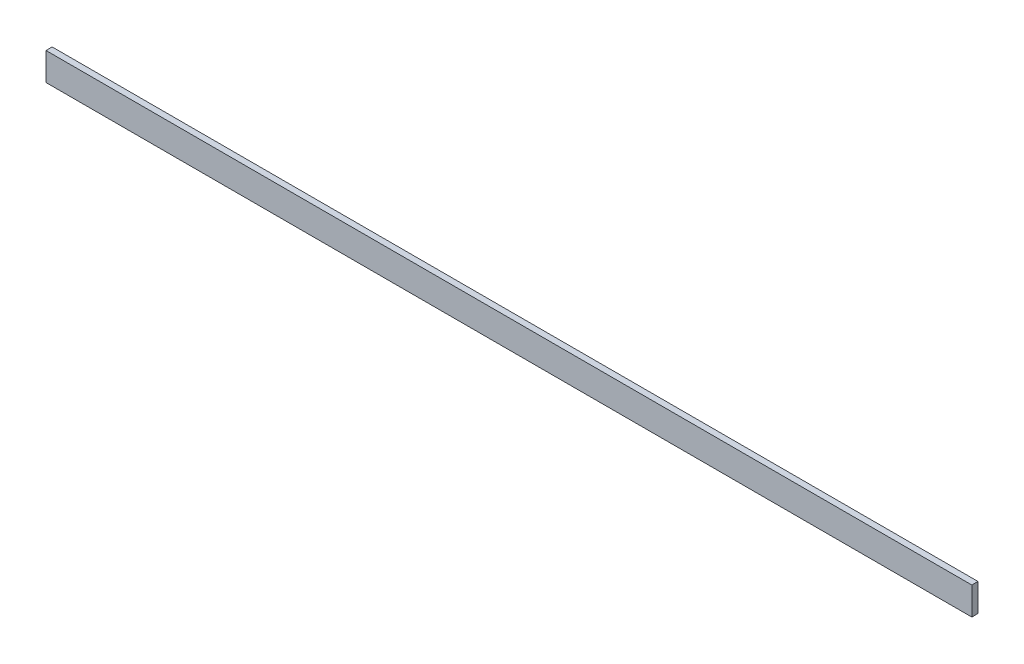
ISO-10303-21;
HEADER;
FILE_DESCRIPTION(('STEP AP214'),'2;1');
FILE_NAME('part.step','',(''),(''),'','','');
FILE_SCHEMA(('AUTOMOTIVE_DESIGN { 1 0 10303 214 1 1 1 1 }'));
ENDSEC;
DATA;
#1=APPLICATION_CONTEXT('core data for automotive mechanical design processes');
#2=APPLICATION_PROTOCOL_DEFINITION('international standard','automotive_design',2000,#1);
#3=PRODUCT_CONTEXT('',#1,'mechanical');
#4=PRODUCT('Part','Part','',(#3));
#5=PRODUCT_RELATED_PRODUCT_CATEGORY('part','',(#4));
#6=PRODUCT_DEFINITION_FORMATION('','',#4);
#7=PRODUCT_DEFINITION_CONTEXT('part definition',#1,'design');
#8=PRODUCT_DEFINITION('design','',#6,#7);
#9=PRODUCT_DEFINITION_SHAPE('','',#8);
#10=(LENGTH_UNIT() NAMED_UNIT(*) SI_UNIT(.MILLI.,.METRE.));
#11=(NAMED_UNIT(*) PLANE_ANGLE_UNIT() SI_UNIT($,.RADIAN.));
#12=(NAMED_UNIT(*) SI_UNIT($,.STERADIAN.) SOLID_ANGLE_UNIT());
#13=UNCERTAINTY_MEASURE_WITH_UNIT(LENGTH_MEASURE(1.E-05),#10,'distance_accuracy_value','');
#14=(GEOMETRIC_REPRESENTATION_CONTEXT(3) GLOBAL_UNCERTAINTY_ASSIGNED_CONTEXT((#13)) GLOBAL_UNIT_ASSIGNED_CONTEXT((#10,
#11,#12)) REPRESENTATION_CONTEXT('',''));
#15=CARTESIAN_POINT('',(0.,0.,0.));
#16=DIRECTION('',(0.,0.,1.));
#17=DIRECTION('',(1.,0.,0.));
#18=AXIS2_PLACEMENT_3D('',#15,#16,#17);
#19=CARTESIAN_POINT('',(-123.621120621464,34.7998479798228,20.));
#20=DIRECTION('',(1.,0.,0.));
#21=DIRECTION('',(0.,1.,0.));
#22=AXIS2_PLACEMENT_3D('',#19,#20,#21);
#23=PLANE('',#22);
#24=DIRECTION('',(0.,-1.,0.));
#25=VECTOR('',#24,1.);
#26=CARTESIAN_POINT('',(-123.621120621464,34.7998479798228,0.));
#27=LINE('',#26,#25);
#28=CARTESIAN_POINT('',(-123.621120621464,34.7998479798228,0.));
#29=VERTEX_POINT('',#28);
#30=CARTESIAN_POINT('',(-123.621120621464,-55.2001520201772,0.));
#31=VERTEX_POINT('',#30);
#32=EDGE_CURVE('E95',#29,#31,#27,.T.);
#33=ORIENTED_EDGE('',*,*,#32,.T.);
#34=DIRECTION('',(0.,0.,-1.));
#35=VECTOR('',#34,1.);
#36=CARTESIAN_POINT('',(-123.621120621464,-55.2001520201772,20.));
#37=LINE('',#36,#35);
#38=CARTESIAN_POINT('',(-123.621120621464,-55.2001520201772,20.));
#39=VERTEX_POINT('',#38);
#40=EDGE_CURVE('E11',#39,#31,#37,.T.);
#41=ORIENTED_EDGE('',*,*,#40,.F.);
#42=DIRECTION('',(0.,-1.,0.));
#43=VECTOR('',#42,1.);
#44=CARTESIAN_POINT('',(-123.621120621464,34.7998479798228,20.));
#45=LINE('',#44,#43);
#46=CARTESIAN_POINT('',(-123.621120621464,34.7998479798228,20.));
#47=VERTEX_POINT('',#46);
#48=EDGE_CURVE('E83',#47,#39,#45,.T.);
#49=ORIENTED_EDGE('',*,*,#48,.F.);
#50=DIRECTION('',(0.,0.,-1.));
#51=VECTOR('',#50,1.);
#52=CARTESIAN_POINT('',(-123.621120621464,34.7998479798228,20.));
#53=LINE('',#52,#51);
#54=EDGE_CURVE('E91',#47,#29,#53,.T.);
#55=ORIENTED_EDGE('',*,*,#54,.T.);
#56=EDGE_LOOP('',(#33,#41,#49,#55));
#57=FACE_BOUND('',#56,.T.);
#58=ADVANCED_FACE('F32',(#57),#23,.F.);
#59=CARTESIAN_POINT('',(-123.621120621464,-55.2001520201772,20.));
#60=DIRECTION('',(0.,1.,0.));
#61=DIRECTION('',(0.,0.,1.));
#62=AXIS2_PLACEMENT_3D('',#59,#60,#61);
#63=PLANE('',#62);
#64=DIRECTION('',(1.,0.,0.));
#65=VECTOR('',#64,1.);
#66=CARTESIAN_POINT('',(-123.621120621464,-55.2001520201772,0.));
#67=LINE('',#66,#65);
#68=CARTESIAN_POINT('',(2876.37887937854,-55.2001520201772,0.));
#69=VERTEX_POINT('',#68);
#70=EDGE_CURVE('E87',#31,#69,#67,.T.);
#71=ORIENTED_EDGE('',*,*,#70,.T.);
#72=DIRECTION('',(0.,0.,-1.));
#73=VECTOR('',#72,1.);
#74=CARTESIAN_POINT('',(2876.37887937854,-55.2001520201772,20.));
#75=LINE('',#74,#73);
#76=CARTESIAN_POINT('',(2876.37887937854,-55.2001520201772,20.));
#77=VERTEX_POINT('',#76);
#78=EDGE_CURVE('E40',#77,#69,#75,.T.);
#79=ORIENTED_EDGE('',*,*,#78,.F.);
#80=DIRECTION('',(1.,0.,0.));
#81=VECTOR('',#80,1.);
#82=CARTESIAN_POINT('',(-123.621120621464,-55.2001520201772,20.));
#83=LINE('',#82,#81);
#84=EDGE_CURVE('E78',#39,#77,#83,.T.);
#85=ORIENTED_EDGE('',*,*,#84,.F.);
#86=ORIENTED_EDGE('',*,*,#40,.T.);
#87=EDGE_LOOP('',(#71,#79,#85,#86));
#88=FACE_BOUND('',#87,.T.);
#89=ADVANCED_FACE('F86',(#88),#63,.F.);
#90=CARTESIAN_POINT('',(2876.37887937854,34.7998479798228,20.));
#91=DIRECTION('',(-1.,0.,0.));
#92=DIRECTION('',(0.,0.,1.));
#93=AXIS2_PLACEMENT_3D('',#90,#91,#92);
#94=PLANE('',#93);
#95=DIRECTION('',(0.,1.,0.));
#96=VECTOR('',#95,1.);
#97=CARTESIAN_POINT('',(2876.37887937854,34.7998479798228,0.));
#98=LINE('',#97,#96);
#99=CARTESIAN_POINT('',(2876.37887937854,34.7998479798228,0.));
#100=VERTEX_POINT('',#99);
#101=EDGE_CURVE('E65',#69,#100,#98,.T.);
#102=ORIENTED_EDGE('',*,*,#101,.T.);
#103=DIRECTION('',(0.,0.,-1.));
#104=VECTOR('',#103,1.);
#105=CARTESIAN_POINT('',(2876.37887937854,34.7998479798228,20.));
#106=LINE('',#105,#104);
#107=CARTESIAN_POINT('',(2876.37887937854,34.7998479798228,20.));
#108=VERTEX_POINT('',#107);
#109=EDGE_CURVE('E88',#108,#100,#106,.T.);
#110=ORIENTED_EDGE('',*,*,#109,.F.);
#111=DIRECTION('',(0.,1.,0.));
#112=VECTOR('',#111,1.);
#113=CARTESIAN_POINT('',(2876.37887937854,34.7998479798228,20.));
#114=LINE('',#113,#112);
#115=EDGE_CURVE('E81',#77,#108,#114,.T.);
#116=ORIENTED_EDGE('',*,*,#115,.F.);
#117=ORIENTED_EDGE('',*,*,#78,.T.);
#118=EDGE_LOOP('',(#102,#110,#116,#117));
#119=FACE_BOUND('',#118,.T.);
#120=ADVANCED_FACE('F89',(#119),#94,.F.);
#121=CARTESIAN_POINT('',(-123.621120621464,34.7998479798228,20.));
#122=DIRECTION('',(0.,-1.,0.));
#123=DIRECTION('',(0.,0.,-1.));
#124=AXIS2_PLACEMENT_3D('',#121,#122,#123);
#125=PLANE('',#124);
#126=DIRECTION('',(-1.,0.,0.));
#127=VECTOR('',#126,1.);
#128=CARTESIAN_POINT('',(-123.621120621464,34.7998479798228,0.));
#129=LINE('',#128,#127);
#130=EDGE_CURVE('E71',#100,#29,#129,.T.);
#131=ORIENTED_EDGE('',*,*,#130,.T.);
#132=ORIENTED_EDGE('',*,*,#54,.F.);
#133=DIRECTION('',(-1.,0.,0.));
#134=VECTOR('',#133,1.);
#135=CARTESIAN_POINT('',(-123.621120621464,34.7998479798228,20.));
#136=LINE('',#135,#134);
#137=EDGE_CURVE('E48',#108,#47,#136,.T.);
#138=ORIENTED_EDGE('',*,*,#137,.F.);
#139=ORIENTED_EDGE('',*,*,#109,.T.);
#140=EDGE_LOOP('',(#131,#132,#138,#139));
#141=FACE_BOUND('',#140,.T.);
#142=ADVANCED_FACE('F102',(#141),#125,.F.);
#143=CARTESIAN_POINT('',(0.,0.,20.));
#144=DIRECTION('',(0.,0.,1.));
#145=DIRECTION('',(1.,0.,0.));
#146=AXIS2_PLACEMENT_3D('',#143,#144,#145);
#147=PLANE('',#146);
#148=ORIENTED_EDGE('',*,*,#48,.T.);
#149=ORIENTED_EDGE('',*,*,#84,.T.);
#150=ORIENTED_EDGE('',*,*,#115,.T.);
#151=ORIENTED_EDGE('',*,*,#137,.T.);
#152=EDGE_LOOP('',(#148,#149,#150,#151));
#153=FACE_BOUND('',#152,.T.);
#154=ADVANCED_FACE('F79',(#153),#147,.T.);
#155=CARTESIAN_POINT('',(0.,0.,0.));
#156=DIRECTION('',(0.,0.,1.));
#157=DIRECTION('',(1.,0.,0.));
#158=AXIS2_PLACEMENT_3D('',#155,#156,#157);
#159=PLANE('',#158);
#160=ORIENTED_EDGE('',*,*,#32,.F.);
#161=ORIENTED_EDGE('',*,*,#130,.F.);
#162=ORIENTED_EDGE('',*,*,#101,.F.);
#163=ORIENTED_EDGE('',*,*,#70,.F.);
#164=EDGE_LOOP('',(#160,#161,#162,#163));
#165=FACE_BOUND('',#164,.T.);
#166=ADVANCED_FACE('F105',(#165),#159,.F.);
#167=CLOSED_SHELL('',(#58,#89,#120,#142,#154,#166));
#168=MANIFOLD_SOLID_BREP('B2',#167);
#169=ADVANCED_BREP_SHAPE_REPRESENTATION('',(#18,#168),#14);
#170=SHAPE_DEFINITION_REPRESENTATION(#9,#169);
ENDSEC;
END-ISO-10303-21;
